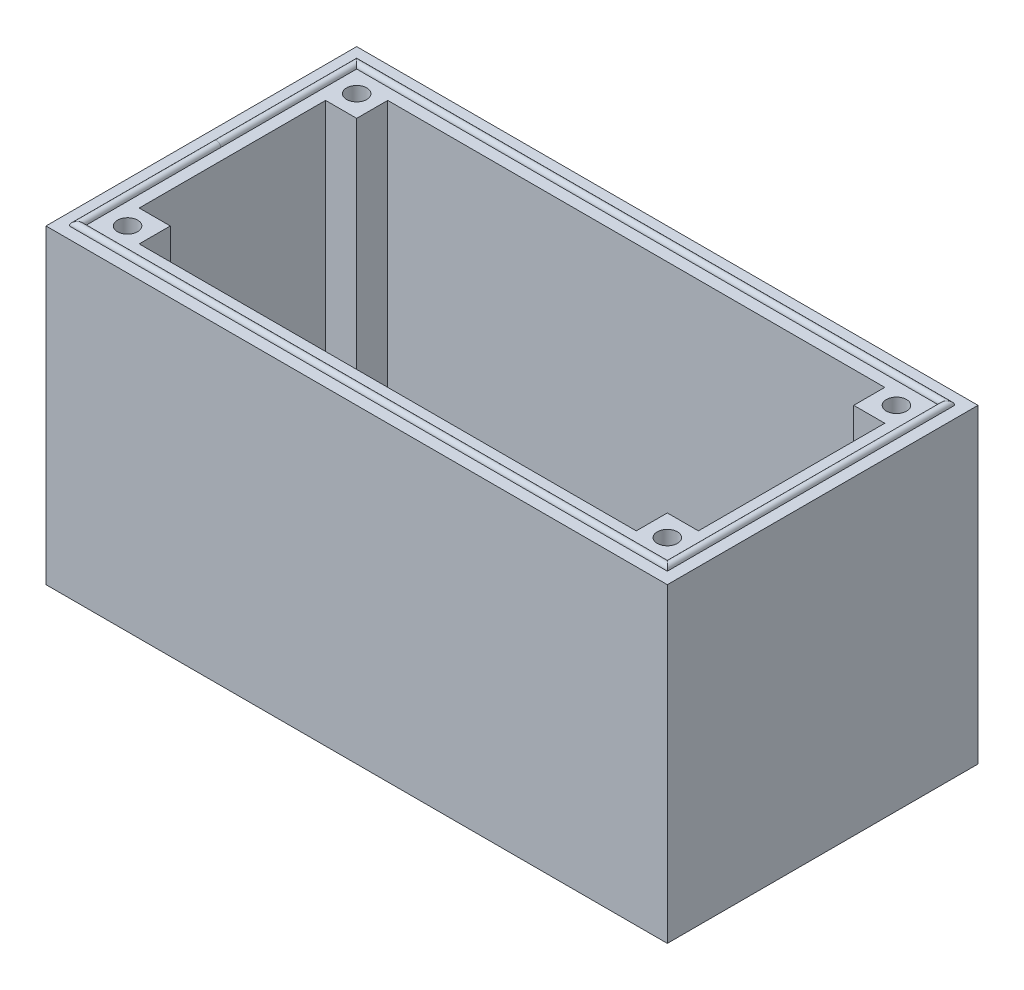
ISO-10303-21;
HEADER;
FILE_DESCRIPTION(('STEP AP214'),'2;1');
FILE_NAME('part.step','',(''),(''),'','','');
FILE_SCHEMA(('AUTOMOTIVE_DESIGN { 1 0 10303 214 1 1 1 1 }'));
ENDSEC;
DATA;
#1=APPLICATION_CONTEXT('core data for automotive mechanical design processes');
#2=APPLICATION_PROTOCOL_DEFINITION('international standard','automotive_design',2000,#1);
#3=PRODUCT_CONTEXT('',#1,'mechanical');
#4=PRODUCT('Part','Part','',(#3));
#5=PRODUCT_RELATED_PRODUCT_CATEGORY('part','',(#4));
#6=PRODUCT_DEFINITION_FORMATION('','',#4);
#7=PRODUCT_DEFINITION_CONTEXT('part definition',#1,'design');
#8=PRODUCT_DEFINITION('design','',#6,#7);
#9=PRODUCT_DEFINITION_SHAPE('','',#8);
#10=(LENGTH_UNIT() NAMED_UNIT(*) SI_UNIT(.MILLI.,.METRE.));
#11=(NAMED_UNIT(*) PLANE_ANGLE_UNIT() SI_UNIT($,.RADIAN.));
#12=(NAMED_UNIT(*) SI_UNIT($,.STERADIAN.) SOLID_ANGLE_UNIT());
#13=UNCERTAINTY_MEASURE_WITH_UNIT(LENGTH_MEASURE(1.E-05),#10,'distance_accuracy_value','');
#14=(GEOMETRIC_REPRESENTATION_CONTEXT(3) GLOBAL_UNCERTAINTY_ASSIGNED_CONTEXT((#13)) GLOBAL_UNIT_ASSIGNED_CONTEXT((#10,
#11,#12)) REPRESENTATION_CONTEXT('',''));
#15=CARTESIAN_POINT('',(0.,0.,0.));
#16=DIRECTION('',(0.,0.,1.));
#17=DIRECTION('',(1.,0.,0.));
#18=AXIS2_PLACEMENT_3D('',#15,#16,#17);
#19=CARTESIAN_POINT('',(40.,0.,-20.));
#20=DIRECTION('',(0.,-1.,0.));
#21=DIRECTION('',(0.,0.,-1.));
#22=AXIS2_PLACEMENT_3D('',#19,#20,#21);
#23=PLANE('',#22);
#24=CARTESIAN_POINT('',(2.62500000000001,0.,-17.375));
#25=DIRECTION('',(0.,-1.,0.));
#26=DIRECTION('',(0.,0.,-1.));
#27=AXIS2_PLACEMENT_3D('',#24,#25,#26);
#28=CIRCLE('',#27,0.675);
#29=CARTESIAN_POINT('',(2.62500000000001,0.,-18.05));
#30=VERTEX_POINT('',#29);
#31=EDGE_CURVE('E889',#30,#30,#28,.T.);
#32=ORIENTED_EDGE('',*,*,#31,.F.);
#33=EDGE_LOOP('',(#32));
#34=FACE_BOUND('',#33,.T.);
#35=CARTESIAN_POINT('',(2.62500000000001,0.,-2.625));
#36=DIRECTION('',(0.,-1.,0.));
#37=DIRECTION('',(0.,0.,-1.));
#38=AXIS2_PLACEMENT_3D('',#35,#36,#37);
#39=CIRCLE('',#38,0.675);
#40=CARTESIAN_POINT('',(2.62500000000001,0.,-3.3));
#41=VERTEX_POINT('',#40);
#42=EDGE_CURVE('E509',#41,#41,#39,.T.);
#43=ORIENTED_EDGE('',*,*,#42,.F.);
#44=EDGE_LOOP('',(#43));
#45=FACE_BOUND('',#44,.T.);
#46=CARTESIAN_POINT('',(37.375,0.,-2.625));
#47=DIRECTION('',(0.,-1.,0.));
#48=DIRECTION('',(0.,0.,-1.));
#49=AXIS2_PLACEMENT_3D('',#46,#47,#48);
#50=CIRCLE('',#49,0.675000000000002);
#51=CARTESIAN_POINT('',(37.375,0.,-3.3));
#52=VERTEX_POINT('',#51);
#53=EDGE_CURVE('E500',#52,#52,#50,.T.);
#54=ORIENTED_EDGE('',*,*,#53,.F.);
#55=EDGE_LOOP('',(#54));
#56=FACE_BOUND('',#55,.T.);
#57=CARTESIAN_POINT('',(37.375,0.,-17.375));
#58=DIRECTION('',(0.,-1.,0.));
#59=DIRECTION('',(0.,0.,-1.));
#60=AXIS2_PLACEMENT_3D('',#57,#58,#59);
#61=CIRCLE('',#60,0.675000000000002);
#62=CARTESIAN_POINT('',(37.375,0.,-18.05));
#63=VERTEX_POINT('',#62);
#64=EDGE_CURVE('E495',#63,#63,#61,.T.);
#65=ORIENTED_EDGE('',*,*,#64,.F.);
#66=EDGE_LOOP('',(#65));
#67=FACE_BOUND('',#66,.T.);
#68=DIRECTION('',(-1.,0.,0.));
#69=VECTOR('',#68,1.);
#70=CARTESIAN_POINT('',(39.375,0.,-18.75));
#71=LINE('',#70,#69);
#72=CARTESIAN_POINT('',(38.75,0.,-18.75));
#73=VERTEX_POINT('',#72);
#74=CARTESIAN_POINT('',(1.25000000000001,0.,-18.75));
#75=VERTEX_POINT('',#74);
#76=EDGE_CURVE('E258',#73,#75,#71,.T.);
#77=ORIENTED_EDGE('',*,*,#76,.F.);
#78=DIRECTION('',(0.,0.,-1.));
#79=VECTOR('',#78,1.);
#80=CARTESIAN_POINT('',(38.75,0.,-0.625000000000001));
#81=LINE('',#80,#79);
#82=CARTESIAN_POINT('',(38.75,0.,-1.25));
#83=VERTEX_POINT('',#82);
#84=EDGE_CURVE('E533',#83,#73,#81,.T.);
#85=ORIENTED_EDGE('',*,*,#84,.F.);
#86=DIRECTION('',(1.,0.,0.));
#87=VECTOR('',#86,1.);
#88=CARTESIAN_POINT('',(0.625000000000002,0.,-1.25));
#89=LINE('',#88,#87);
#90=CARTESIAN_POINT('',(1.25,0.,-1.25));
#91=VERTEX_POINT('',#90);
#92=EDGE_CURVE('E238',#91,#83,#89,.T.);
#93=ORIENTED_EDGE('',*,*,#92,.F.);
#94=DIRECTION('',(0.,0.,1.));
#95=VECTOR('',#94,1.);
#96=CARTESIAN_POINT('',(1.25,0.,-10.));
#97=LINE('',#96,#95);
#98=CARTESIAN_POINT('',(1.25,0.,-10.));
#99=VERTEX_POINT('',#98);
#100=EDGE_CURVE('E65',#99,#91,#97,.T.);
#101=ORIENTED_EDGE('',*,*,#100,.F.);
#102=DIRECTION('',(0.,0.,1.));
#103=VECTOR('',#102,1.);
#104=CARTESIAN_POINT('',(1.25,0.,-19.375));
#105=LINE('',#104,#103);
#106=EDGE_CURVE('E263',#75,#99,#105,.T.);
#107=ORIENTED_EDGE('',*,*,#106,.F.);
#108=EDGE_LOOP('',(#77,#85,#93,#101,#107));
#109=FACE_BOUND('',#108,.T.);
#110=DIRECTION('',(0.,0.,1.));
#111=VECTOR('',#110,1.);
#112=CARTESIAN_POINT('',(36.,0.,-3.99999999999999));
#113=LINE('',#112,#111);
#114=CARTESIAN_POINT('',(36.,0.,-3.99999999999999));
#115=VERTEX_POINT('',#114);
#116=CARTESIAN_POINT('',(36.,0.,-2.));
#117=VERTEX_POINT('',#116);
#118=EDGE_CURVE('E323',#115,#117,#113,.T.);
#119=ORIENTED_EDGE('',*,*,#118,.F.);
#120=DIRECTION('',(-1.,0.,0.));
#121=VECTOR('',#120,1.);
#122=CARTESIAN_POINT('',(38.,0.,-4.));
#123=LINE('',#122,#121);
#124=CARTESIAN_POINT('',(38.,0.,-4.));
#125=VERTEX_POINT('',#124);
#126=EDGE_CURVE('E320',#125,#115,#123,.T.);
#127=ORIENTED_EDGE('',*,*,#126,.F.);
#128=DIRECTION('',(0.,0.,-1.));
#129=VECTOR('',#128,1.);
#130=CARTESIAN_POINT('',(38.,0.,-4.));
#131=LINE('',#130,#129);
#132=CARTESIAN_POINT('',(38.,0.,-16.));
#133=VERTEX_POINT('',#132);
#134=EDGE_CURVE('E360',#125,#133,#131,.T.);
#135=ORIENTED_EDGE('',*,*,#134,.T.);
#136=DIRECTION('',(1.,0.,0.));
#137=VECTOR('',#136,1.);
#138=CARTESIAN_POINT('',(36.,0.,-16.));
#139=LINE('',#138,#137);
#140=CARTESIAN_POINT('',(36.,0.,-16.));
#141=VERTEX_POINT('',#140);
#142=EDGE_CURVE('E356',#141,#133,#139,.T.);
#143=ORIENTED_EDGE('',*,*,#142,.F.);
#144=DIRECTION('',(0.,0.,1.));
#145=VECTOR('',#144,1.);
#146=CARTESIAN_POINT('',(36.,0.,-18.));
#147=LINE('',#146,#145);
#148=CARTESIAN_POINT('',(36.,0.,-18.));
#149=VERTEX_POINT('',#148);
#150=EDGE_CURVE('E353',#149,#141,#147,.T.);
#151=ORIENTED_EDGE('',*,*,#150,.F.);
#152=DIRECTION('',(-1.,0.,0.));
#153=VECTOR('',#152,1.);
#154=CARTESIAN_POINT('',(36.,0.,-18.));
#155=LINE('',#154,#153);
#156=CARTESIAN_POINT('',(3.99999999999999,0.,-18.));
#157=VERTEX_POINT('',#156);
#158=EDGE_CURVE('E349',#149,#157,#155,.T.);
#159=ORIENTED_EDGE('',*,*,#158,.T.);
#160=DIRECTION('',(0.,0.,1.));
#161=VECTOR('',#160,1.);
#162=CARTESIAN_POINT('',(3.99999999999999,0.,-18.));
#163=LINE('',#162,#161);
#164=CARTESIAN_POINT('',(3.99999999999999,0.,-16.));
#165=VERTEX_POINT('',#164);
#166=EDGE_CURVE('E345',#157,#165,#163,.T.);
#167=ORIENTED_EDGE('',*,*,#166,.T.);
#168=DIRECTION('',(-1.,0.,0.));
#169=VECTOR('',#168,1.);
#170=CARTESIAN_POINT('',(3.99999999999999,0.,-16.));
#171=LINE('',#170,#169);
#172=CARTESIAN_POINT('',(2.,0.,-16.));
#173=VERTEX_POINT('',#172);
#174=EDGE_CURVE('E341',#165,#173,#171,.T.);
#175=ORIENTED_EDGE('',*,*,#174,.T.);
#176=DIRECTION('',(0.,0.,-1.));
#177=VECTOR('',#176,1.);
#178=CARTESIAN_POINT('',(2.,0.,-3.99999999999999));
#179=LINE('',#178,#177);
#180=CARTESIAN_POINT('',(2.,0.,-3.99999999999999));
#181=VERTEX_POINT('',#180);
#182=EDGE_CURVE('E338',#181,#173,#179,.T.);
#183=ORIENTED_EDGE('',*,*,#182,.F.);
#184=DIRECTION('',(1.,0.,0.));
#185=VECTOR('',#184,1.);
#186=CARTESIAN_POINT('',(2.,0.,-3.99999999999999));
#187=LINE('',#186,#185);
#188=CARTESIAN_POINT('',(3.99999999999999,0.,-3.99999999999999));
#189=VERTEX_POINT('',#188);
#190=EDGE_CURVE('E334',#181,#189,#187,.T.);
#191=ORIENTED_EDGE('',*,*,#190,.T.);
#192=DIRECTION('',(0.,0.,1.));
#193=VECTOR('',#192,1.);
#194=CARTESIAN_POINT('',(3.99999999999999,0.,-3.99999999999999));
#195=LINE('',#194,#193);
#196=CARTESIAN_POINT('',(3.99999999999999,0.,-2.));
#197=VERTEX_POINT('',#196);
#198=EDGE_CURVE('E330',#189,#197,#195,.T.);
#199=ORIENTED_EDGE('',*,*,#198,.T.);
#200=DIRECTION('',(-1.,0.,0.));
#201=VECTOR('',#200,1.);
#202=CARTESIAN_POINT('',(36.,0.,-2.));
#203=LINE('',#202,#201);
#204=EDGE_CURVE('E327',#117,#197,#203,.T.);
#205=ORIENTED_EDGE('',*,*,#204,.F.);
#206=EDGE_LOOP('',(#119,#127,#135,#143,#151,#159,#167,#175,#183,#191,#199,#205));
#207=FACE_BOUND('',#206,.T.);
#208=ADVANCED_FACE('F47',(#34,#45,#56,#67,#109,#207),#23,.T.);
#209=CARTESIAN_POINT('',(0.,20.,-20.));
#210=DIRECTION('',(0.,1.,0.));
#211=DIRECTION('',(0.,0.,1.));
#212=AXIS2_PLACEMENT_3D('',#209,#210,#211);
#213=PLANE('',#212);
#214=CARTESIAN_POINT('',(2.62500000000001,20.,-17.375));
#215=DIRECTION('',(0.,1.,0.));
#216=DIRECTION('',(0.,0.,1.));
#217=AXIS2_PLACEMENT_3D('',#214,#215,#216);
#218=CIRCLE('',#217,0.649999999999992);
#219=CARTESIAN_POINT('',(2.62500000000001,20.,-16.725));
#220=VERTEX_POINT('',#219);
#221=EDGE_CURVE('E51',#220,#220,#218,.T.);
#222=ORIENTED_EDGE('',*,*,#221,.F.);
#223=EDGE_LOOP('',(#222));
#224=FACE_BOUND('',#223,.T.);
#225=CARTESIAN_POINT('',(2.62500000000001,20.,-2.625));
#226=DIRECTION('',(0.,1.,0.));
#227=DIRECTION('',(0.,0.,1.));
#228=AXIS2_PLACEMENT_3D('',#225,#226,#227);
#229=CIRCLE('',#228,0.649999999999992);
#230=CARTESIAN_POINT('',(2.62500000000001,20.,-1.97500000000001));
#231=VERTEX_POINT('',#230);
#232=EDGE_CURVE('E497',#231,#231,#229,.T.);
#233=ORIENTED_EDGE('',*,*,#232,.F.);
#234=EDGE_LOOP('',(#233));
#235=FACE_BOUND('',#234,.T.);
#236=CARTESIAN_POINT('',(37.375,20.,-2.625));
#237=DIRECTION('',(0.,1.,0.));
#238=DIRECTION('',(0.,0.,1.));
#239=AXIS2_PLACEMENT_3D('',#236,#237,#238);
#240=CIRCLE('',#239,0.649999999999991);
#241=CARTESIAN_POINT('',(37.375,20.,-1.97500000000001));
#242=VERTEX_POINT('',#241);
#243=EDGE_CURVE('E492',#242,#242,#240,.T.);
#244=ORIENTED_EDGE('',*,*,#243,.F.);
#245=EDGE_LOOP('',(#244));
#246=FACE_BOUND('',#245,.T.);
#247=CARTESIAN_POINT('',(37.375,20.,-17.375));
#248=DIRECTION('',(0.,1.,0.));
#249=DIRECTION('',(0.,0.,1.));
#250=AXIS2_PLACEMENT_3D('',#247,#248,#249);
#251=CIRCLE('',#250,0.649999999999991);
#252=CARTESIAN_POINT('',(37.375,20.,-16.725));
#253=VERTEX_POINT('',#252);
#254=EDGE_CURVE('E259',#253,#253,#251,.T.);
#255=ORIENTED_EDGE('',*,*,#254,.F.);
#256=EDGE_LOOP('',(#255));
#257=FACE_BOUND('',#256,.T.);
#258=DIRECTION('',(0.,0.,-1.));
#259=VECTOR('',#258,1.);
#260=CARTESIAN_POINT('',(38.,20.,-4.));
#261=LINE('',#260,#259);
#262=CARTESIAN_POINT('',(38.,20.,-4.));
#263=VERTEX_POINT('',#262);
#264=CARTESIAN_POINT('',(38.,20.,-16.));
#265=VERTEX_POINT('',#264);
#266=EDGE_CURVE('E324',#263,#265,#261,.T.);
#267=ORIENTED_EDGE('',*,*,#266,.F.);
#268=DIRECTION('',(-1.,0.,0.));
#269=VECTOR('',#268,1.);
#270=CARTESIAN_POINT('',(38.,20.,-4.));
#271=LINE('',#270,#269);
#272=CARTESIAN_POINT('',(36.,20.,-3.99999999999999));
#273=VERTEX_POINT('',#272);
#274=EDGE_CURVE('E280',#263,#273,#271,.T.);
#275=ORIENTED_EDGE('',*,*,#274,.T.);
#276=DIRECTION('',(0.,0.,1.));
#277=VECTOR('',#276,1.);
#278=CARTESIAN_POINT('',(36.,20.,-3.99999999999999));
#279=LINE('',#278,#277);
#280=CARTESIAN_POINT('',(36.,20.,-2.));
#281=VERTEX_POINT('',#280);
#282=EDGE_CURVE('E368',#273,#281,#279,.T.);
#283=ORIENTED_EDGE('',*,*,#282,.T.);
#284=DIRECTION('',(-1.,0.,0.));
#285=VECTOR('',#284,1.);
#286=CARTESIAN_POINT('',(36.,20.,-2.));
#287=LINE('',#286,#285);
#288=CARTESIAN_POINT('',(3.99999999999999,20.,-2.));
#289=VERTEX_POINT('',#288);
#290=EDGE_CURVE('E372',#281,#289,#287,.T.);
#291=ORIENTED_EDGE('',*,*,#290,.T.);
#292=DIRECTION('',(0.,0.,1.));
#293=VECTOR('',#292,1.);
#294=CARTESIAN_POINT('',(3.99999999999999,20.,-3.99999999999999));
#295=LINE('',#294,#293);
#296=CARTESIAN_POINT('',(3.99999999999999,20.,-3.99999999999999));
#297=VERTEX_POINT('',#296);
#298=EDGE_CURVE('E376',#297,#289,#295,.T.);
#299=ORIENTED_EDGE('',*,*,#298,.F.);
#300=DIRECTION('',(1.,0.,0.));
#301=VECTOR('',#300,1.);
#302=CARTESIAN_POINT('',(2.,20.,-3.99999999999999));
#303=LINE('',#302,#301);
#304=CARTESIAN_POINT('',(2.,20.,-3.99999999999999));
#305=VERTEX_POINT('',#304);
#306=EDGE_CURVE('E380',#305,#297,#303,.T.);
#307=ORIENTED_EDGE('',*,*,#306,.F.);
#308=DIRECTION('',(0.,0.,-1.));
#309=VECTOR('',#308,1.);
#310=CARTESIAN_POINT('',(2.,20.,-3.99999999999999));
#311=LINE('',#310,#309);
#312=CARTESIAN_POINT('',(2.,20.,-16.));
#313=VERTEX_POINT('',#312);
#314=EDGE_CURVE('E384',#305,#313,#311,.T.);
#315=ORIENTED_EDGE('',*,*,#314,.T.);
#316=DIRECTION('',(-1.,0.,0.));
#317=VECTOR('',#316,1.);
#318=CARTESIAN_POINT('',(3.99999999999999,20.,-16.));
#319=LINE('',#318,#317);
#320=CARTESIAN_POINT('',(3.99999999999999,20.,-16.));
#321=VERTEX_POINT('',#320);
#322=EDGE_CURVE('E388',#321,#313,#319,.T.);
#323=ORIENTED_EDGE('',*,*,#322,.F.);
#324=DIRECTION('',(0.,0.,1.));
#325=VECTOR('',#324,1.);
#326=CARTESIAN_POINT('',(3.99999999999999,20.,-18.));
#327=LINE('',#326,#325);
#328=CARTESIAN_POINT('',(3.99999999999999,20.,-18.));
#329=VERTEX_POINT('',#328);
#330=EDGE_CURVE('E392',#329,#321,#327,.T.);
#331=ORIENTED_EDGE('',*,*,#330,.F.);
#332=DIRECTION('',(-1.,0.,0.));
#333=VECTOR('',#332,1.);
#334=CARTESIAN_POINT('',(36.,20.,-18.));
#335=LINE('',#334,#333);
#336=CARTESIAN_POINT('',(36.,20.,-18.));
#337=VERTEX_POINT('',#336);
#338=EDGE_CURVE('E396',#337,#329,#335,.T.);
#339=ORIENTED_EDGE('',*,*,#338,.F.);
#340=DIRECTION('',(0.,0.,1.));
#341=VECTOR('',#340,1.);
#342=CARTESIAN_POINT('',(36.,20.,-18.));
#343=LINE('',#342,#341);
#344=CARTESIAN_POINT('',(36.,20.,-16.));
#345=VERTEX_POINT('',#344);
#346=EDGE_CURVE('E400',#337,#345,#343,.T.);
#347=ORIENTED_EDGE('',*,*,#346,.T.);
#348=DIRECTION('',(1.,0.,0.));
#349=VECTOR('',#348,1.);
#350=CARTESIAN_POINT('',(36.,20.,-16.));
#351=LINE('',#350,#349);
#352=EDGE_CURVE('E404',#345,#265,#351,.T.);
#353=ORIENTED_EDGE('',*,*,#352,.T.);
#354=EDGE_LOOP('',(#267,#275,#283,#291,#299,#307,#315,#323,#331,#339,#347,#353));
#355=FACE_BOUND('',#354,.T.);
#356=DIRECTION('',(0.,0.,-1.));
#357=VECTOR('',#356,1.);
#358=CARTESIAN_POINT('',(1.24999999999999,20.,-0.624999999999994));
#359=LINE('',#358,#357);
#360=CARTESIAN_POINT('',(1.24999999999999,20.,-1.24999999999999));
#361=VERTEX_POINT('',#360);
#362=CARTESIAN_POINT('',(1.24999999999999,20.,-10.));
#363=VERTEX_POINT('',#362);
#364=EDGE_CURVE('E292',#361,#363,#359,.T.);
#365=ORIENTED_EDGE('',*,*,#364,.F.);
#366=DIRECTION('',(-1.,0.,0.));
#367=VECTOR('',#366,1.);
#368=CARTESIAN_POINT('',(39.375,20.,-1.24999999999999));
#369=LINE('',#368,#367);
#370=CARTESIAN_POINT('',(38.75,20.,-1.24999999999999));
#371=VERTEX_POINT('',#370);
#372=EDGE_CURVE('E296',#371,#361,#369,.T.);
#373=ORIENTED_EDGE('',*,*,#372,.F.);
#374=DIRECTION('',(0.,0.,1.));
#375=VECTOR('',#374,1.);
#376=CARTESIAN_POINT('',(38.75,20.,-19.375));
#377=LINE('',#376,#375);
#378=CARTESIAN_POINT('',(38.75,20.,-18.75));
#379=VERTEX_POINT('',#378);
#380=EDGE_CURVE('E285',#379,#371,#377,.T.);
#381=ORIENTED_EDGE('',*,*,#380,.F.);
#382=DIRECTION('',(1.,0.,0.));
#383=VECTOR('',#382,1.);
#384=CARTESIAN_POINT('',(0.624999999999994,20.,-18.75));
#385=LINE('',#384,#383);
#386=CARTESIAN_POINT('',(1.25,20.,-18.75));
#387=VERTEX_POINT('',#386);
#388=EDGE_CURVE('E276',#387,#379,#385,.T.);
#389=ORIENTED_EDGE('',*,*,#388,.F.);
#390=DIRECTION('',(0.,0.,-1.));
#391=VECTOR('',#390,1.);
#392=CARTESIAN_POINT('',(1.24999999999999,20.,-10.));
#393=LINE('',#392,#391);
#394=EDGE_CURVE('E307',#363,#387,#393,.T.);
#395=ORIENTED_EDGE('',*,*,#394,.F.);
#396=EDGE_LOOP('',(#365,#373,#381,#389,#395));
#397=FACE_BOUND('',#396,.T.);
#398=ADVANCED_FACE('F573',(#224,#235,#246,#257,#355,#397),#213,.T.);
#399=DIRECTION('',(-1.,0.,0.));
#400=VECTOR('',#399,1.);
#401=CARTESIAN_POINT('',(0.,20.,0.));
#402=LINE('',#401,#400);
#403=CARTESIAN_POINT('',(40.,20.,0.));
#404=VERTEX_POINT('',#403);
#405=CARTESIAN_POINT('',(0.,20.,0.));
#406=VERTEX_POINT('',#405);
#407=EDGE_CURVE('E474',#404,#406,#402,.T.);
#408=ORIENTED_EDGE('',*,*,#407,.F.);
#409=DIRECTION('',(0.,0.,1.));
#410=VECTOR('',#409,1.);
#411=CARTESIAN_POINT('',(40.,20.,-20.));
#412=LINE('',#411,#410);
#413=CARTESIAN_POINT('',(40.,20.,-20.));
#414=VERTEX_POINT('',#413);
#415=EDGE_CURVE('E483',#414,#404,#412,.T.);
#416=ORIENTED_EDGE('',*,*,#415,.F.);
#417=DIRECTION('',(-1.,0.,0.));
#418=VECTOR('',#417,1.);
#419=CARTESIAN_POINT('',(0.,20.,-20.));
#420=LINE('',#419,#418);
#421=CARTESIAN_POINT('',(0.,20.,-20.));
#422=VERTEX_POINT('',#421);
#423=EDGE_CURVE('E458',#414,#422,#420,.T.);
#424=ORIENTED_EDGE('',*,*,#423,.T.);
#425=DIRECTION('',(0.,0.,1.));
#426=VECTOR('',#425,1.);
#427=CARTESIAN_POINT('',(0.,20.,-20.));
#428=LINE('',#427,#426);
#429=EDGE_CURVE('E57',#422,#406,#428,.T.);
#430=ORIENTED_EDGE('',*,*,#429,.T.);
#431=EDGE_LOOP('',(#408,#416,#424,#430));
#432=FACE_BOUND('',#431,.T.);
#433=DIRECTION('',(0.,0.,1.));
#434=VECTOR('',#433,1.);
#435=CARTESIAN_POINT('',(39.25,20.,-19.375));
#436=LINE('',#435,#434);
#437=CARTESIAN_POINT('',(39.25,20.,-19.25));
#438=VERTEX_POINT('',#437);
#439=CARTESIAN_POINT('',(39.25,20.,-0.749999999999993));
#440=VERTEX_POINT('',#439);
#441=EDGE_CURVE('E281',#438,#440,#436,.T.);
#442=ORIENTED_EDGE('',*,*,#441,.T.);
#443=DIRECTION('',(-1.,0.,0.));
#444=VECTOR('',#443,1.);
#445=CARTESIAN_POINT('',(39.375,20.,-0.749999999999993));
#446=LINE('',#445,#444);
#447=CARTESIAN_POINT('',(0.749999999999993,20.,-0.749999999999994));
#448=VERTEX_POINT('',#447);
#449=EDGE_CURVE('E313',#440,#448,#446,.T.);
#450=ORIENTED_EDGE('',*,*,#449,.T.);
#451=DIRECTION('',(0.,0.,-1.));
#452=VECTOR('',#451,1.);
#453=CARTESIAN_POINT('',(0.749999999999993,20.,-0.624999999999994));
#454=LINE('',#453,#452);
#455=CARTESIAN_POINT('',(0.749999999999993,20.,-10.));
#456=VERTEX_POINT('',#455);
#457=EDGE_CURVE('E295',#448,#456,#454,.T.);
#458=ORIENTED_EDGE('',*,*,#457,.T.);
#459=DIRECTION('',(0.,0.,-1.));
#460=VECTOR('',#459,1.);
#461=CARTESIAN_POINT('',(0.749999999999993,20.,-10.));
#462=LINE('',#461,#460);
#463=CARTESIAN_POINT('',(0.749999999999994,20.,-19.25));
#464=VERTEX_POINT('',#463);
#465=EDGE_CURVE('E303',#456,#464,#462,.T.);
#466=ORIENTED_EDGE('',*,*,#465,.T.);
#467=DIRECTION('',(1.,0.,0.));
#468=VECTOR('',#467,1.);
#469=CARTESIAN_POINT('',(0.624999999999994,20.,-19.25));
#470=LINE('',#469,#468);
#471=EDGE_CURVE('E267',#464,#438,#470,.T.);
#472=ORIENTED_EDGE('',*,*,#471,.T.);
#473=EDGE_LOOP('',(#442,#450,#458,#466,#472));
#474=FACE_BOUND('',#473,.T.);
#475=ADVANCED_FACE('F578',(#432,#474),#213,.T.);
#476=DIRECTION('',(-1.,0.,0.));
#477=VECTOR('',#476,1.);
#478=CARTESIAN_POINT('',(39.375,0.,-19.25));
#479=LINE('',#478,#477);
#480=CARTESIAN_POINT('',(39.25,0.,-19.25));
#481=VERTEX_POINT('',#480);
#482=CARTESIAN_POINT('',(0.750000000000004,0.,-19.25));
#483=VERTEX_POINT('',#482);
#484=EDGE_CURVE('E255',#481,#483,#479,.T.);
#485=ORIENTED_EDGE('',*,*,#484,.T.);
#486=DIRECTION('',(0.,0.,1.));
#487=VECTOR('',#486,1.);
#488=CARTESIAN_POINT('',(0.750000000000001,0.,-19.375));
#489=LINE('',#488,#487);
#490=CARTESIAN_POINT('',(0.750000000000001,0.,-10.));
#491=VERTEX_POINT('',#490);
#492=EDGE_CURVE('E244',#483,#491,#489,.T.);
#493=ORIENTED_EDGE('',*,*,#492,.T.);
#494=DIRECTION('',(0.,0.,1.));
#495=VECTOR('',#494,1.);
#496=CARTESIAN_POINT('',(0.750000000000001,0.,-10.));
#497=LINE('',#496,#495);
#498=CARTESIAN_POINT('',(0.750000000000001,0.,-0.750000000000002));
#499=VERTEX_POINT('',#498);
#500=EDGE_CURVE('E224',#491,#499,#497,.T.);
#501=ORIENTED_EDGE('',*,*,#500,.T.);
#502=DIRECTION('',(1.,0.,0.));
#503=VECTOR('',#502,1.);
#504=CARTESIAN_POINT('',(0.625000000000002,0.,-0.750000000000002));
#505=LINE('',#504,#503);
#506=CARTESIAN_POINT('',(39.25,0.,-0.750000000000001));
#507=VERTEX_POINT('',#506);
#508=EDGE_CURVE('E234',#499,#507,#505,.T.);
#509=ORIENTED_EDGE('',*,*,#508,.T.);
#510=DIRECTION('',(0.,0.,-1.));
#511=VECTOR('',#510,1.);
#512=CARTESIAN_POINT('',(39.25,0.,-0.625000000000001));
#513=LINE('',#512,#511);
#514=EDGE_CURVE('E73',#507,#481,#513,.T.);
#515=ORIENTED_EDGE('',*,*,#514,.T.);
#516=EDGE_LOOP('',(#485,#493,#501,#509,#515));
#517=FACE_BOUND('',#516,.T.);
#518=DIRECTION('',(1.,0.,0.));
#519=VECTOR('',#518,1.);
#520=CARTESIAN_POINT('',(40.,0.,0.));
#521=LINE('',#520,#519);
#522=CARTESIAN_POINT('',(0.,0.,0.));
#523=VERTEX_POINT('',#522);
#524=CARTESIAN_POINT('',(40.,0.,0.));
#525=VERTEX_POINT('',#524);
#526=EDGE_CURVE('E448',#523,#525,#521,.T.);
#527=ORIENTED_EDGE('',*,*,#526,.F.);
#528=DIRECTION('',(0.,0.,1.));
#529=VECTOR('',#528,1.);
#530=CARTESIAN_POINT('',(0.,0.,-20.));
#531=LINE('',#530,#529);
#532=CARTESIAN_POINT('',(0.,0.,-20.));
#533=VERTEX_POINT('',#532);
#534=EDGE_CURVE('E11',#533,#523,#531,.T.);
#535=ORIENTED_EDGE('',*,*,#534,.F.);
#536=DIRECTION('',(1.,0.,0.));
#537=VECTOR('',#536,1.);
#538=CARTESIAN_POINT('',(40.,0.,-20.));
#539=LINE('',#538,#537);
#540=CARTESIAN_POINT('',(40.,0.,-20.));
#541=VERTEX_POINT('',#540);
#542=EDGE_CURVE('E449',#533,#541,#539,.T.);
#543=ORIENTED_EDGE('',*,*,#542,.T.);
#544=DIRECTION('',(0.,0.,1.));
#545=VECTOR('',#544,1.);
#546=CARTESIAN_POINT('',(40.,0.,-20.));
#547=LINE('',#546,#545);
#548=EDGE_CURVE('E466',#541,#525,#547,.T.);
#549=ORIENTED_EDGE('',*,*,#548,.T.);
#550=EDGE_LOOP('',(#527,#535,#543,#549));
#551=FACE_BOUND('',#550,.T.);
#552=ADVANCED_FACE('F49',(#517,#551),#23,.T.);
#553=CARTESIAN_POINT('',(0.,0.,-20.));
#554=DIRECTION('',(-1.,0.,0.));
#555=DIRECTION('',(0.,-1.,0.));
#556=AXIS2_PLACEMENT_3D('',#553,#554,#555);
#557=PLANE('',#556);
#558=DIRECTION('',(0.,-1.,0.));
#559=VECTOR('',#558,1.);
#560=CARTESIAN_POINT('',(0.,0.,0.));
#561=LINE('',#560,#559);
#562=EDGE_CURVE('E454',#406,#523,#561,.T.);
#563=ORIENTED_EDGE('',*,*,#562,.F.);
#564=ORIENTED_EDGE('',*,*,#429,.F.);
#565=DIRECTION('',(0.,-1.,0.));
#566=VECTOR('',#565,1.);
#567=CARTESIAN_POINT('',(0.,0.,-20.));
#568=LINE('',#567,#566);
#569=EDGE_CURVE('E462',#422,#533,#568,.T.);
#570=ORIENTED_EDGE('',*,*,#569,.T.);
#571=ORIENTED_EDGE('',*,*,#534,.T.);
#572=EDGE_LOOP('',(#563,#564,#570,#571));
#573=FACE_BOUND('',#572,.T.);
#574=ADVANCED_FACE('F584',(#573),#557,.T.);
#575=CARTESIAN_POINT('',(40.,20.,-20.));
#576=DIRECTION('',(1.,0.,0.));
#577=DIRECTION('',(0.,1.,0.));
#578=AXIS2_PLACEMENT_3D('',#575,#576,#577);
#579=PLANE('',#578);
#580=DIRECTION('',(0.,1.,0.));
#581=VECTOR('',#580,1.);
#582=CARTESIAN_POINT('',(40.,20.,0.));
#583=LINE('',#582,#581);
#584=EDGE_CURVE('E470',#525,#404,#583,.T.);
#585=ORIENTED_EDGE('',*,*,#584,.F.);
#586=ORIENTED_EDGE('',*,*,#548,.F.);
#587=DIRECTION('',(0.,1.,0.));
#588=VECTOR('',#587,1.);
#589=CARTESIAN_POINT('',(40.,20.,-20.));
#590=LINE('',#589,#588);
#591=EDGE_CURVE('E453',#541,#414,#590,.T.);
#592=ORIENTED_EDGE('',*,*,#591,.T.);
#593=ORIENTED_EDGE('',*,*,#415,.T.);
#594=EDGE_LOOP('',(#585,#586,#592,#593));
#595=FACE_BOUND('',#594,.T.);
#596=ADVANCED_FACE('F589',(#595),#579,.T.);
#597=CARTESIAN_POINT('',(0.,0.,-20.));
#598=DIRECTION('',(0.,0.,-1.));
#599=DIRECTION('',(-1.,0.,0.));
#600=AXIS2_PLACEMENT_3D('',#597,#598,#599);
#601=PLANE('',#600);
#602=ORIENTED_EDGE('',*,*,#542,.F.);
#603=ORIENTED_EDGE('',*,*,#569,.F.);
#604=ORIENTED_EDGE('',*,*,#423,.F.);
#605=ORIENTED_EDGE('',*,*,#591,.F.);
#606=EDGE_LOOP('',(#602,#603,#604,#605));
#607=FACE_BOUND('',#606,.T.);
#608=ADVANCED_FACE('F599',(#607),#601,.T.);
#609=CARTESIAN_POINT('',(0.,0.,0.));
#610=DIRECTION('',(0.,0.,-1.));
#611=DIRECTION('',(-1.,0.,0.));
#612=AXIS2_PLACEMENT_3D('',#609,#610,#611);
#613=PLANE('',#612);
#614=ORIENTED_EDGE('',*,*,#526,.T.);
#615=ORIENTED_EDGE('',*,*,#584,.T.);
#616=ORIENTED_EDGE('',*,*,#407,.T.);
#617=ORIENTED_EDGE('',*,*,#562,.T.);
#618=EDGE_LOOP('',(#614,#615,#616,#617));
#619=FACE_BOUND('',#618,.T.);
#620=ADVANCED_FACE('F604',(#619),#613,.F.);
#621=CARTESIAN_POINT('',(38.,0.,-4.));
#622=DIRECTION('',(0.,0.,-1.));
#623=DIRECTION('',(-1.,0.,0.));
#624=AXIS2_PLACEMENT_3D('',#621,#622,#623);
#625=PLANE('',#624);
#626=ORIENTED_EDGE('',*,*,#274,.F.);
#627=DIRECTION('',(0.,1.,0.));
#628=VECTOR('',#627,1.);
#629=CARTESIAN_POINT('',(38.,0.,-4.));
#630=LINE('',#629,#628);
#631=EDGE_CURVE('E364',#125,#263,#630,.T.);
#632=ORIENTED_EDGE('',*,*,#631,.F.);
#633=ORIENTED_EDGE('',*,*,#126,.T.);
#634=DIRECTION('',(0.,1.,0.));
#635=VECTOR('',#634,1.);
#636=CARTESIAN_POINT('',(36.,0.,-3.99999999999999));
#637=LINE('',#636,#635);
#638=EDGE_CURVE('E444',#115,#273,#637,.T.);
#639=ORIENTED_EDGE('',*,*,#638,.T.);
#640=EDGE_LOOP('',(#626,#632,#633,#639));
#641=FACE_BOUND('',#640,.T.);
#642=ADVANCED_FACE('F616',(#641),#625,.T.);
#643=CARTESIAN_POINT('',(36.,0.,-3.99999999999999));
#644=DIRECTION('',(-1.,0.,0.));
#645=DIRECTION('',(0.,0.,1.));
#646=AXIS2_PLACEMENT_3D('',#643,#644,#645);
#647=PLANE('',#646);
#648=ORIENTED_EDGE('',*,*,#282,.F.);
#649=ORIENTED_EDGE('',*,*,#638,.F.);
#650=ORIENTED_EDGE('',*,*,#118,.T.);
#651=DIRECTION('',(0.,1.,0.));
#652=VECTOR('',#651,1.);
#653=CARTESIAN_POINT('',(36.,0.,-2.));
#654=LINE('',#653,#652);
#655=EDGE_CURVE('E441',#117,#281,#654,.T.);
#656=ORIENTED_EDGE('',*,*,#655,.T.);
#657=EDGE_LOOP('',(#648,#649,#650,#656));
#658=FACE_BOUND('',#657,.T.);
#659=ADVANCED_FACE('F620',(#658),#647,.T.);
#660=CARTESIAN_POINT('',(36.,0.,-2.));
#661=DIRECTION('',(0.,0.,-1.));
#662=DIRECTION('',(-1.,0.,0.));
#663=AXIS2_PLACEMENT_3D('',#660,#661,#662);
#664=PLANE('',#663);
#665=ORIENTED_EDGE('',*,*,#290,.F.);
#666=ORIENTED_EDGE('',*,*,#655,.F.);
#667=ORIENTED_EDGE('',*,*,#204,.T.);
#668=DIRECTION('',(0.,1.,0.));
#669=VECTOR('',#668,1.);
#670=CARTESIAN_POINT('',(3.99999999999999,0.,-2.));
#671=LINE('',#670,#669);
#672=EDGE_CURVE('E438',#197,#289,#671,.T.);
#673=ORIENTED_EDGE('',*,*,#672,.T.);
#674=EDGE_LOOP('',(#665,#666,#667,#673));
#675=FACE_BOUND('',#674,.T.);
#676=ADVANCED_FACE('F626',(#675),#664,.T.);
#677=CARTESIAN_POINT('',(3.99999999999999,0.,-3.99999999999999));
#678=DIRECTION('',(-1.,0.,0.));
#679=DIRECTION('',(0.,0.,1.));
#680=AXIS2_PLACEMENT_3D('',#677,#678,#679);
#681=PLANE('',#680);
#682=ORIENTED_EDGE('',*,*,#298,.T.);
#683=ORIENTED_EDGE('',*,*,#672,.F.);
#684=ORIENTED_EDGE('',*,*,#198,.F.);
#685=DIRECTION('',(0.,1.,0.));
#686=VECTOR('',#685,1.);
#687=CARTESIAN_POINT('',(3.99999999999999,0.,-3.99999999999999));
#688=LINE('',#687,#686);
#689=EDGE_CURVE('E435',#189,#297,#688,.T.);
#690=ORIENTED_EDGE('',*,*,#689,.T.);
#691=EDGE_LOOP('',(#682,#683,#684,#690));
#692=FACE_BOUND('',#691,.T.);
#693=ADVANCED_FACE('F630',(#692),#681,.F.);
#694=CARTESIAN_POINT('',(2.,0.,-3.99999999999999));
#695=DIRECTION('',(0.,0.,1.));
#696=DIRECTION('',(1.,0.,0.));
#697=AXIS2_PLACEMENT_3D('',#694,#695,#696);
#698=PLANE('',#697);
#699=ORIENTED_EDGE('',*,*,#306,.T.);
#700=ORIENTED_EDGE('',*,*,#689,.F.);
#701=ORIENTED_EDGE('',*,*,#190,.F.);
#702=DIRECTION('',(0.,1.,0.));
#703=VECTOR('',#702,1.);
#704=CARTESIAN_POINT('',(2.,0.,-3.99999999999999));
#705=LINE('',#704,#703);
#706=EDGE_CURVE('E432',#181,#305,#705,.T.);
#707=ORIENTED_EDGE('',*,*,#706,.T.);
#708=EDGE_LOOP('',(#699,#700,#701,#707));
#709=FACE_BOUND('',#708,.T.);
#710=ADVANCED_FACE('F634',(#709),#698,.F.);
#711=CARTESIAN_POINT('',(2.,0.,-3.99999999999999));
#712=DIRECTION('',(1.,0.,0.));
#713=DIRECTION('',(0.,0.,-1.));
#714=AXIS2_PLACEMENT_3D('',#711,#712,#713);
#715=PLANE('',#714);
#716=ORIENTED_EDGE('',*,*,#314,.F.);
#717=ORIENTED_EDGE('',*,*,#706,.F.);
#718=ORIENTED_EDGE('',*,*,#182,.T.);
#719=DIRECTION('',(0.,1.,0.));
#720=VECTOR('',#719,1.);
#721=CARTESIAN_POINT('',(2.,0.,-16.));
#722=LINE('',#721,#720);
#723=EDGE_CURVE('E429',#173,#313,#722,.T.);
#724=ORIENTED_EDGE('',*,*,#723,.T.);
#725=EDGE_LOOP('',(#716,#717,#718,#724));
#726=FACE_BOUND('',#725,.T.);
#727=ADVANCED_FACE('F638',(#726),#715,.T.);
#728=CARTESIAN_POINT('',(3.99999999999999,0.,-16.));
#729=DIRECTION('',(0.,0.,-1.));
#730=DIRECTION('',(-1.,0.,0.));
#731=AXIS2_PLACEMENT_3D('',#728,#729,#730);
#732=PLANE('',#731);
#733=ORIENTED_EDGE('',*,*,#322,.T.);
#734=ORIENTED_EDGE('',*,*,#723,.F.);
#735=ORIENTED_EDGE('',*,*,#174,.F.);
#736=DIRECTION('',(0.,1.,0.));
#737=VECTOR('',#736,1.);
#738=CARTESIAN_POINT('',(3.99999999999999,0.,-16.));
#739=LINE('',#738,#737);
#740=EDGE_CURVE('E426',#165,#321,#739,.T.);
#741=ORIENTED_EDGE('',*,*,#740,.T.);
#742=EDGE_LOOP('',(#733,#734,#735,#741));
#743=FACE_BOUND('',#742,.T.);
#744=ADVANCED_FACE('F642',(#743),#732,.F.);
#745=CARTESIAN_POINT('',(3.99999999999999,0.,-18.));
#746=DIRECTION('',(-1.,0.,0.));
#747=DIRECTION('',(0.,0.,1.));
#748=AXIS2_PLACEMENT_3D('',#745,#746,#747);
#749=PLANE('',#748);
#750=ORIENTED_EDGE('',*,*,#330,.T.);
#751=ORIENTED_EDGE('',*,*,#740,.F.);
#752=ORIENTED_EDGE('',*,*,#166,.F.);
#753=DIRECTION('',(0.,1.,0.));
#754=VECTOR('',#753,1.);
#755=CARTESIAN_POINT('',(3.99999999999999,0.,-18.));
#756=LINE('',#755,#754);
#757=EDGE_CURVE('E423',#157,#329,#756,.T.);
#758=ORIENTED_EDGE('',*,*,#757,.T.);
#759=EDGE_LOOP('',(#750,#751,#752,#758));
#760=FACE_BOUND('',#759,.T.);
#761=ADVANCED_FACE('F646',(#760),#749,.F.);
#762=CARTESIAN_POINT('',(36.,0.,-18.));
#763=DIRECTION('',(0.,0.,-1.));
#764=DIRECTION('',(-1.,0.,0.));
#765=AXIS2_PLACEMENT_3D('',#762,#763,#764);
#766=PLANE('',#765);
#767=ORIENTED_EDGE('',*,*,#338,.T.);
#768=ORIENTED_EDGE('',*,*,#757,.F.);
#769=ORIENTED_EDGE('',*,*,#158,.F.);
#770=DIRECTION('',(0.,1.,0.));
#771=VECTOR('',#770,1.);
#772=CARTESIAN_POINT('',(36.,0.,-18.));
#773=LINE('',#772,#771);
#774=EDGE_CURVE('E420',#149,#337,#773,.T.);
#775=ORIENTED_EDGE('',*,*,#774,.T.);
#776=EDGE_LOOP('',(#767,#768,#769,#775));
#777=FACE_BOUND('',#776,.T.);
#778=ADVANCED_FACE('F650',(#777),#766,.F.);
#779=CARTESIAN_POINT('',(36.,0.,-18.));
#780=DIRECTION('',(-1.,0.,0.));
#781=DIRECTION('',(0.,0.,1.));
#782=AXIS2_PLACEMENT_3D('',#779,#780,#781);
#783=PLANE('',#782);
#784=ORIENTED_EDGE('',*,*,#346,.F.);
#785=ORIENTED_EDGE('',*,*,#774,.F.);
#786=ORIENTED_EDGE('',*,*,#150,.T.);
#787=DIRECTION('',(0.,1.,0.));
#788=VECTOR('',#787,1.);
#789=CARTESIAN_POINT('',(36.,0.,-16.));
#790=LINE('',#789,#788);
#791=EDGE_CURVE('E417',#141,#345,#790,.T.);
#792=ORIENTED_EDGE('',*,*,#791,.T.);
#793=EDGE_LOOP('',(#784,#785,#786,#792));
#794=FACE_BOUND('',#793,.T.);
#795=ADVANCED_FACE('F654',(#794),#783,.T.);
#796=CARTESIAN_POINT('',(36.,0.,-16.));
#797=DIRECTION('',(0.,0.,1.));
#798=DIRECTION('',(1.,0.,0.));
#799=AXIS2_PLACEMENT_3D('',#796,#797,#798);
#800=PLANE('',#799);
#801=ORIENTED_EDGE('',*,*,#352,.F.);
#802=ORIENTED_EDGE('',*,*,#791,.F.);
#803=ORIENTED_EDGE('',*,*,#142,.T.);
#804=DIRECTION('',(0.,1.,0.));
#805=VECTOR('',#804,1.);
#806=CARTESIAN_POINT('',(38.,0.,-16.));
#807=LINE('',#806,#805);
#808=EDGE_CURVE('E414',#133,#265,#807,.T.);
#809=ORIENTED_EDGE('',*,*,#808,.T.);
#810=EDGE_LOOP('',(#801,#802,#803,#809));
#811=FACE_BOUND('',#810,.T.);
#812=ADVANCED_FACE('F658',(#811),#800,.T.);
#813=CARTESIAN_POINT('',(38.,0.,-4.));
#814=DIRECTION('',(1.,0.,0.));
#815=DIRECTION('',(0.,0.,-1.));
#816=AXIS2_PLACEMENT_3D('',#813,#814,#815);
#817=PLANE('',#816);
#818=ORIENTED_EDGE('',*,*,#266,.T.);
#819=ORIENTED_EDGE('',*,*,#808,.F.);
#820=ORIENTED_EDGE('',*,*,#134,.F.);
#821=ORIENTED_EDGE('',*,*,#631,.T.);
#822=EDGE_LOOP('',(#818,#819,#820,#821));
#823=FACE_BOUND('',#822,.T.);
#824=ADVANCED_FACE('F566',(#823),#817,.F.);
#825=CARTESIAN_POINT('',(39.375,20.,-0.999999999999993));
#826=DIRECTION('',(-1.,0.,0.));
#827=DIRECTION('',(0.,0.,1.));
#828=AXIS2_PLACEMENT_3D('',#825,#826,#827);
#829=CYLINDRICAL_SURFACE('',#828,0.25);
#830=ORIENTED_EDGE('',*,*,#449,.F.);
#831=CARTESIAN_POINT('',(39.,20.,-0.999999999999994));
#832=DIRECTION('',(-0.707106781186548,0.,0.707106781186548));
#833=DIRECTION('',(0.707106781186548,0.,0.707106781186548));
#834=AXIS2_PLACEMENT_3D('',#831,#832,#833);
#835=ELLIPSE('',#834,0.353553390593274,0.25);
#836=EDGE_CURVE('E272',#440,#371,#835,.T.);
#837=ORIENTED_EDGE('',*,*,#836,.T.);
#838=ORIENTED_EDGE('',*,*,#372,.T.);
#839=CARTESIAN_POINT('',(0.999999999999993,20.,-0.999999999999994));
#840=DIRECTION('',(-0.707106781186547,0.,-0.707106781186547));
#841=DIRECTION('',(0.707106781186548,0.,-0.707106781186548));
#842=AXIS2_PLACEMENT_3D('',#839,#840,#841);
#843=ELLIPSE('',#842,0.353553390593274,0.25);
#844=EDGE_CURVE('E286',#448,#361,#843,.T.);
#845=ORIENTED_EDGE('',*,*,#844,.F.);
#846=EDGE_LOOP('',(#830,#837,#838,#845));
#847=FACE_BOUND('',#846,.T.);
#848=ADVANCED_FACE('F665',(#847),#829,.T.);
#849=CARTESIAN_POINT('',(0.999999999999993,20.,-0.624999999999994));
#850=DIRECTION('',(0.,0.,-1.));
#851=DIRECTION('',(-1.,0.,0.));
#852=AXIS2_PLACEMENT_3D('',#849,#850,#851);
#853=CYLINDRICAL_SURFACE('',#852,0.25);
#854=ORIENTED_EDGE('',*,*,#844,.T.);
#855=ORIENTED_EDGE('',*,*,#364,.T.);
#856=CARTESIAN_POINT('',(0.999999999999993,20.,-10.));
#857=DIRECTION('',(0.,0.,1.));
#858=DIRECTION('',(1.,0.,0.));
#859=AXIS2_PLACEMENT_3D('',#856,#857,#858);
#860=CIRCLE('',#859,0.25);
#861=EDGE_CURVE('E300',#363,#456,#860,.T.);
#862=ORIENTED_EDGE('',*,*,#861,.T.);
#863=ORIENTED_EDGE('',*,*,#457,.F.);
#864=EDGE_LOOP('',(#854,#855,#862,#863));
#865=FACE_BOUND('',#864,.T.);
#866=ADVANCED_FACE('F669',(#865),#853,.T.);
#867=CARTESIAN_POINT('',(0.999999999999993,20.,-10.));
#868=DIRECTION('',(0.,0.,-1.));
#869=DIRECTION('',(-1.,0.,0.));
#870=AXIS2_PLACEMENT_3D('',#867,#868,#869);
#871=CYLINDRICAL_SURFACE('',#870,0.25);
#872=ORIENTED_EDGE('',*,*,#465,.F.);
#873=ORIENTED_EDGE('',*,*,#861,.F.);
#874=ORIENTED_EDGE('',*,*,#394,.T.);
#875=CARTESIAN_POINT('',(0.999999999999997,20.,-19.));
#876=DIRECTION('',(0.707106781186548,0.,-0.707106781186548));
#877=DIRECTION('',(0.707106781186548,0.,0.707106781186548));
#878=AXIS2_PLACEMENT_3D('',#875,#876,#877);
#879=ELLIPSE('',#878,0.353553390593274,0.25);
#880=EDGE_CURVE('E268',#464,#387,#879,.T.);
#881=ORIENTED_EDGE('',*,*,#880,.F.);
#882=EDGE_LOOP('',(#872,#873,#874,#881));
#883=FACE_BOUND('',#882,.T.);
#884=ADVANCED_FACE('F671',(#883),#871,.T.);
#885=CARTESIAN_POINT('',(39.,20.,-19.375));
#886=DIRECTION('',(0.,0.,1.));
#887=DIRECTION('',(1.,0.,0.));
#888=AXIS2_PLACEMENT_3D('',#885,#886,#887);
#889=CYLINDRICAL_SURFACE('',#888,0.25);
#890=ORIENTED_EDGE('',*,*,#441,.F.);
#891=CARTESIAN_POINT('',(39.,20.,-19.));
#892=DIRECTION('',(0.707106781186548,0.,0.707106781186547));
#893=DIRECTION('',(0.707106781186547,0.,-0.707106781186548));
#894=AXIS2_PLACEMENT_3D('',#891,#892,#893);
#895=ELLIPSE('',#894,0.353553390593274,0.25);
#896=EDGE_CURVE('E264',#438,#379,#895,.T.);
#897=ORIENTED_EDGE('',*,*,#896,.T.);
#898=ORIENTED_EDGE('',*,*,#380,.T.);
#899=ORIENTED_EDGE('',*,*,#836,.F.);
#900=EDGE_LOOP('',(#890,#897,#898,#899));
#901=FACE_BOUND('',#900,.T.);
#902=ADVANCED_FACE('F563',(#901),#889,.T.);
#903=CARTESIAN_POINT('',(0.624999999999994,20.,-19.));
#904=DIRECTION('',(1.,0.,0.));
#905=DIRECTION('',(0.,0.,-1.));
#906=AXIS2_PLACEMENT_3D('',#903,#904,#905);
#907=CYLINDRICAL_SURFACE('',#906,0.25);
#908=ORIENTED_EDGE('',*,*,#880,.T.);
#909=ORIENTED_EDGE('',*,*,#388,.T.);
#910=ORIENTED_EDGE('',*,*,#896,.F.);
#911=ORIENTED_EDGE('',*,*,#471,.F.);
#912=EDGE_LOOP('',(#908,#909,#910,#911));
#913=FACE_BOUND('',#912,.T.);
#914=ADVANCED_FACE('F555',(#913),#907,.T.);
#915=CARTESIAN_POINT('',(39.375,0.,-19.));
#916=DIRECTION('',(-1.,0.,0.));
#917=DIRECTION('',(0.,0.,1.));
#918=AXIS2_PLACEMENT_3D('',#915,#916,#917);
#919=CYLINDRICAL_SURFACE('',#918,0.25);
#920=ORIENTED_EDGE('',*,*,#484,.F.);
#921=CARTESIAN_POINT('',(39.,0.,-19.));
#922=DIRECTION('',(-0.707106781186548,0.,-0.707106781186547));
#923=DIRECTION('',(0.707106781186547,0.,-0.707106781186548));
#924=AXIS2_PLACEMENT_3D('',#921,#922,#923);
#925=ELLIPSE('',#924,0.353553390593274,0.25);
#926=EDGE_CURVE('E231',#481,#73,#925,.F.);
#927=ORIENTED_EDGE('',*,*,#926,.T.);
#928=ORIENTED_EDGE('',*,*,#76,.T.);
#929=CARTESIAN_POINT('',(1.,0.,-19.));
#930=DIRECTION('',(-0.707106781186547,0.,0.707106781186547));
#931=DIRECTION('',(0.707106781186548,0.,0.707106781186548));
#932=AXIS2_PLACEMENT_3D('',#929,#930,#931);
#933=ELLIPSE('',#932,0.353553390593274,0.25);
#934=EDGE_CURVE('E246',#483,#75,#933,.F.);
#935=ORIENTED_EDGE('',*,*,#934,.F.);
#936=EDGE_LOOP('',(#920,#927,#928,#935));
#937=FACE_BOUND('',#936,.T.);
#938=ADVANCED_FACE('F553',(#937),#919,.F.);
#939=CARTESIAN_POINT('',(1.,0.,-19.375));
#940=DIRECTION('',(0.,0.,1.));
#941=DIRECTION('',(1.,0.,0.));
#942=AXIS2_PLACEMENT_3D('',#939,#940,#941);
#943=CYLINDRICAL_SURFACE('',#942,0.25);
#944=ORIENTED_EDGE('',*,*,#934,.T.);
#945=ORIENTED_EDGE('',*,*,#106,.T.);
#946=CARTESIAN_POINT('',(1.,0.,-10.));
#947=DIRECTION('',(0.,0.,1.));
#948=DIRECTION('',(1.,0.,0.));
#949=AXIS2_PLACEMENT_3D('',#946,#947,#948);
#950=CIRCLE('',#949,0.25);
#951=EDGE_CURVE('E251',#99,#491,#950,.T.);
#952=ORIENTED_EDGE('',*,*,#951,.T.);
#953=ORIENTED_EDGE('',*,*,#492,.F.);
#954=EDGE_LOOP('',(#944,#945,#952,#953));
#955=FACE_BOUND('',#954,.T.);
#956=ADVANCED_FACE('F544',(#955),#943,.F.);
#957=CARTESIAN_POINT('',(1.,0.,-10.));
#958=DIRECTION('',(0.,0.,1.));
#959=DIRECTION('',(1.,0.,0.));
#960=AXIS2_PLACEMENT_3D('',#957,#958,#959);
#961=CYLINDRICAL_SURFACE('',#960,0.25);
#962=ORIENTED_EDGE('',*,*,#500,.F.);
#963=ORIENTED_EDGE('',*,*,#951,.F.);
#964=ORIENTED_EDGE('',*,*,#100,.T.);
#965=CARTESIAN_POINT('',(1.,0.,-1.));
#966=DIRECTION('',(0.707106781186548,0.,0.707106781186548));
#967=DIRECTION('',(0.707106781186548,0.,-0.707106781186548));
#968=AXIS2_PLACEMENT_3D('',#965,#966,#967);
#969=ELLIPSE('',#968,0.353553390593274,0.25);
#970=EDGE_CURVE('E220',#499,#91,#969,.F.);
#971=ORIENTED_EDGE('',*,*,#970,.F.);
#972=EDGE_LOOP('',(#962,#963,#964,#971));
#973=FACE_BOUND('',#972,.T.);
#974=ADVANCED_FACE('F222',(#973),#961,.F.);
#975=CARTESIAN_POINT('',(39.,0.,-0.625000000000001));
#976=DIRECTION('',(0.,0.,-1.));
#977=DIRECTION('',(-1.,0.,0.));
#978=AXIS2_PLACEMENT_3D('',#975,#976,#977);
#979=CYLINDRICAL_SURFACE('',#978,0.25);
#980=ORIENTED_EDGE('',*,*,#514,.F.);
#981=CARTESIAN_POINT('',(39.,0.,-1.));
#982=DIRECTION('',(0.707106781186548,0.,-0.707106781186548));
#983=DIRECTION('',(0.707106781186548,0.,0.707106781186548));
#984=AXIS2_PLACEMENT_3D('',#981,#982,#983);
#985=ELLIPSE('',#984,0.353553390593274,0.25);
#986=EDGE_CURVE('E230',#507,#83,#985,.F.);
#987=ORIENTED_EDGE('',*,*,#986,.T.);
#988=ORIENTED_EDGE('',*,*,#84,.T.);
#989=ORIENTED_EDGE('',*,*,#926,.F.);
#990=EDGE_LOOP('',(#980,#987,#988,#989));
#991=FACE_BOUND('',#990,.T.);
#992=ADVANCED_FACE('F550',(#991),#979,.F.);
#993=CARTESIAN_POINT('',(0.625000000000002,0.,-1.));
#994=DIRECTION('',(1.,0.,0.));
#995=DIRECTION('',(0.,0.,-1.));
#996=AXIS2_PLACEMENT_3D('',#993,#994,#995);
#997=CYLINDRICAL_SURFACE('',#996,0.25);
#998=ORIENTED_EDGE('',*,*,#970,.T.);
#999=ORIENTED_EDGE('',*,*,#92,.T.);
#1000=ORIENTED_EDGE('',*,*,#986,.F.);
#1001=ORIENTED_EDGE('',*,*,#508,.F.);
#1002=EDGE_LOOP('',(#998,#999,#1000,#1001));
#1003=FACE_BOUND('',#1002,.T.);
#1004=ADVANCED_FACE('F235',(#1003),#997,.F.);
#1005=CARTESIAN_POINT('',(37.375,0.,-17.375));
#1006=DIRECTION('',(0.,-1.,0.));
#1007=DIRECTION('',(0.,0.,-1.));
#1008=AXIS2_PLACEMENT_3D('',#1005,#1006,#1007);
#1009=CYLINDRICAL_SURFACE('',#1008,0.649999999999991);
#1010=ORIENTED_EDGE('',*,*,#254,.T.);
#1011=EDGE_LOOP('',(#1010));
#1012=FACE_BOUND('',#1011,.T.);
#1013=CARTESIAN_POINT('',(37.375,0.0249999999999972,-17.375));
#1014=DIRECTION('',(0.,-1.,0.));
#1015=DIRECTION('',(0.,0.,-1.));
#1016=AXIS2_PLACEMENT_3D('',#1013,#1014,#1015);
#1017=CIRCLE('',#1016,0.649999999999984);
#1018=CARTESIAN_POINT('',(37.375,0.0249999999999972,-18.025));
#1019=VERTEX_POINT('',#1018);
#1020=EDGE_CURVE('E491',#1019,#1019,#1017,.T.);
#1021=ORIENTED_EDGE('',*,*,#1020,.T.);
#1022=EDGE_LOOP('',(#1021));
#1023=FACE_BOUND('',#1022,.T.);
#1024=ADVANCED_FACE('F557',(#1012,#1023),#1009,.F.);
#1025=CARTESIAN_POINT('',(37.375,0.,-17.375));
#1026=DIRECTION('',(0.,-1.,0.));
#1027=DIRECTION('',(0.,0.,-1.));
#1028=AXIS2_PLACEMENT_3D('',#1025,#1026,#1027);
#1029=CONICAL_SURFACE('',#1028,0.675000000000002,0.78539816339783);
#1030=ORIENTED_EDGE('',*,*,#1020,.F.);
#1031=EDGE_LOOP('',(#1030));
#1032=FACE_BOUND('',#1031,.T.);
#1033=ORIENTED_EDGE('',*,*,#64,.T.);
#1034=EDGE_LOOP('',(#1033));
#1035=FACE_BOUND('',#1034,.T.);
#1036=ADVANCED_FACE('F569',(#1032,#1035),#1029,.F.);
#1037=CARTESIAN_POINT('',(37.375,0.,-2.625));
#1038=DIRECTION('',(0.,-1.,0.));
#1039=DIRECTION('',(0.,0.,-1.));
#1040=AXIS2_PLACEMENT_3D('',#1037,#1038,#1039);
#1041=CYLINDRICAL_SURFACE('',#1040,0.649999999999991);
#1042=ORIENTED_EDGE('',*,*,#243,.T.);
#1043=EDGE_LOOP('',(#1042));
#1044=FACE_BOUND('',#1043,.T.);
#1045=CARTESIAN_POINT('',(37.375,0.0249999999999972,-2.625));
#1046=DIRECTION('',(0.,-1.,0.));
#1047=DIRECTION('',(0.,0.,-1.));
#1048=AXIS2_PLACEMENT_3D('',#1045,#1046,#1047);
#1049=CIRCLE('',#1048,0.649999999999984);
#1050=CARTESIAN_POINT('',(37.375,0.0249999999999972,-3.27499999999998));
#1051=VERTEX_POINT('',#1050);
#1052=EDGE_CURVE('E496',#1051,#1051,#1049,.T.);
#1053=ORIENTED_EDGE('',*,*,#1052,.T.);
#1054=EDGE_LOOP('',(#1053));
#1055=FACE_BOUND('',#1054,.T.);
#1056=ADVANCED_FACE('F764',(#1044,#1055),#1041,.F.);
#1057=CARTESIAN_POINT('',(37.375,0.,-2.625));
#1058=DIRECTION('',(0.,-1.,0.));
#1059=DIRECTION('',(0.,0.,-1.));
#1060=AXIS2_PLACEMENT_3D('',#1057,#1058,#1059);
#1061=CONICAL_SURFACE('',#1060,0.675000000000002,0.78539816339783);
#1062=ORIENTED_EDGE('',*,*,#1052,.F.);
#1063=EDGE_LOOP('',(#1062));
#1064=FACE_BOUND('',#1063,.T.);
#1065=ORIENTED_EDGE('',*,*,#53,.T.);
#1066=EDGE_LOOP('',(#1065));
#1067=FACE_BOUND('',#1066,.T.);
#1068=ADVANCED_FACE('F777',(#1064,#1067),#1061,.F.);
#1069=CARTESIAN_POINT('',(2.62500000000001,0.,-2.625));
#1070=DIRECTION('',(0.,-1.,0.));
#1071=DIRECTION('',(0.,0.,-1.));
#1072=AXIS2_PLACEMENT_3D('',#1069,#1070,#1071);
#1073=CYLINDRICAL_SURFACE('',#1072,0.649999999999992);
#1074=ORIENTED_EDGE('',*,*,#232,.T.);
#1075=EDGE_LOOP('',(#1074));
#1076=FACE_BOUND('',#1075,.T.);
#1077=CARTESIAN_POINT('',(2.62500000000001,0.0249999999999972,-2.625));
#1078=DIRECTION('',(0.,-1.,0.));
#1079=DIRECTION('',(0.,0.,-1.));
#1080=AXIS2_PLACEMENT_3D('',#1077,#1078,#1079);
#1081=CIRCLE('',#1080,0.649999999999987);
#1082=CARTESIAN_POINT('',(2.62500000000001,0.0249999999999972,-3.27499999999999));
#1083=VERTEX_POINT('',#1082);
#1084=EDGE_CURVE('E501',#1083,#1083,#1081,.T.);
#1085=ORIENTED_EDGE('',*,*,#1084,.T.);
#1086=EDGE_LOOP('',(#1085));
#1087=FACE_BOUND('',#1086,.T.);
#1088=ADVANCED_FACE('F789',(#1076,#1087),#1073,.F.);
#1089=CARTESIAN_POINT('',(2.62500000000001,0.,-2.625));
#1090=DIRECTION('',(0.,-1.,0.));
#1091=DIRECTION('',(0.,0.,-1.));
#1092=AXIS2_PLACEMENT_3D('',#1089,#1090,#1091);
#1093=CONICAL_SURFACE('',#1092,0.675,0.785398163397726);
#1094=ORIENTED_EDGE('',*,*,#1084,.F.);
#1095=EDGE_LOOP('',(#1094));
#1096=FACE_BOUND('',#1095,.T.);
#1097=ORIENTED_EDGE('',*,*,#42,.T.);
#1098=EDGE_LOOP('',(#1097));
#1099=FACE_BOUND('',#1098,.T.);
#1100=ADVANCED_FACE('F814',(#1096,#1099),#1093,.F.);
#1101=CARTESIAN_POINT('',(2.62500000000001,0.,-17.375));
#1102=DIRECTION('',(0.,-1.,0.));
#1103=DIRECTION('',(0.,0.,-1.));
#1104=AXIS2_PLACEMENT_3D('',#1101,#1102,#1103);
#1105=CYLINDRICAL_SURFACE('',#1104,0.649999999999992);
#1106=ORIENTED_EDGE('',*,*,#221,.T.);
#1107=EDGE_LOOP('',(#1106));
#1108=FACE_BOUND('',#1107,.T.);
#1109=CARTESIAN_POINT('',(2.62500000000001,0.0249999999999972,-17.375));
#1110=DIRECTION('',(0.,-1.,0.));
#1111=DIRECTION('',(0.,0.,-1.));
#1112=AXIS2_PLACEMENT_3D('',#1109,#1110,#1111);
#1113=CIRCLE('',#1112,0.649999999999987);
#1114=CARTESIAN_POINT('',(2.62500000000001,0.0249999999999972,-18.025));
#1115=VERTEX_POINT('',#1114);
#1116=EDGE_CURVE('E887',#1115,#1115,#1113,.T.);
#1117=ORIENTED_EDGE('',*,*,#1116,.T.);
#1118=EDGE_LOOP('',(#1117));
#1119=FACE_BOUND('',#1118,.T.);
#1120=ADVANCED_FACE('F827',(#1108,#1119),#1105,.F.);
#1121=CARTESIAN_POINT('',(2.62500000000001,0.,-17.375));
#1122=DIRECTION('',(0.,-1.,0.));
#1123=DIRECTION('',(0.,0.,-1.));
#1124=AXIS2_PLACEMENT_3D('',#1121,#1122,#1123);
#1125=CONICAL_SURFACE('',#1124,0.675,0.785398163397726);
#1126=ORIENTED_EDGE('',*,*,#1116,.F.);
#1127=EDGE_LOOP('',(#1126));
#1128=FACE_BOUND('',#1127,.T.);
#1129=ORIENTED_EDGE('',*,*,#31,.T.);
#1130=EDGE_LOOP('',(#1129));
#1131=FACE_BOUND('',#1130,.T.);
#1132=ADVANCED_FACE('F839',(#1128,#1131),#1125,.F.);
#1133=CLOSED_SHELL('',(#208,#398,#475,#552,#574,#596,#608,#620,#642,#659,#676,#693,#710,#727,
#744,#761,#778,#795,#812,#824,#848,#866,#884,#902,#914,#938,#956,#974,#992,#1004,#1024,#1036,
#1056,#1068,#1088,#1100,#1120,#1132));
#1134=MANIFOLD_SOLID_BREP('B2',#1133);
#1135=ADVANCED_BREP_SHAPE_REPRESENTATION('',(#18,#1134),#14);
#1136=SHAPE_DEFINITION_REPRESENTATION(#9,#1135);
ENDSEC;
END-ISO-10303-21;
